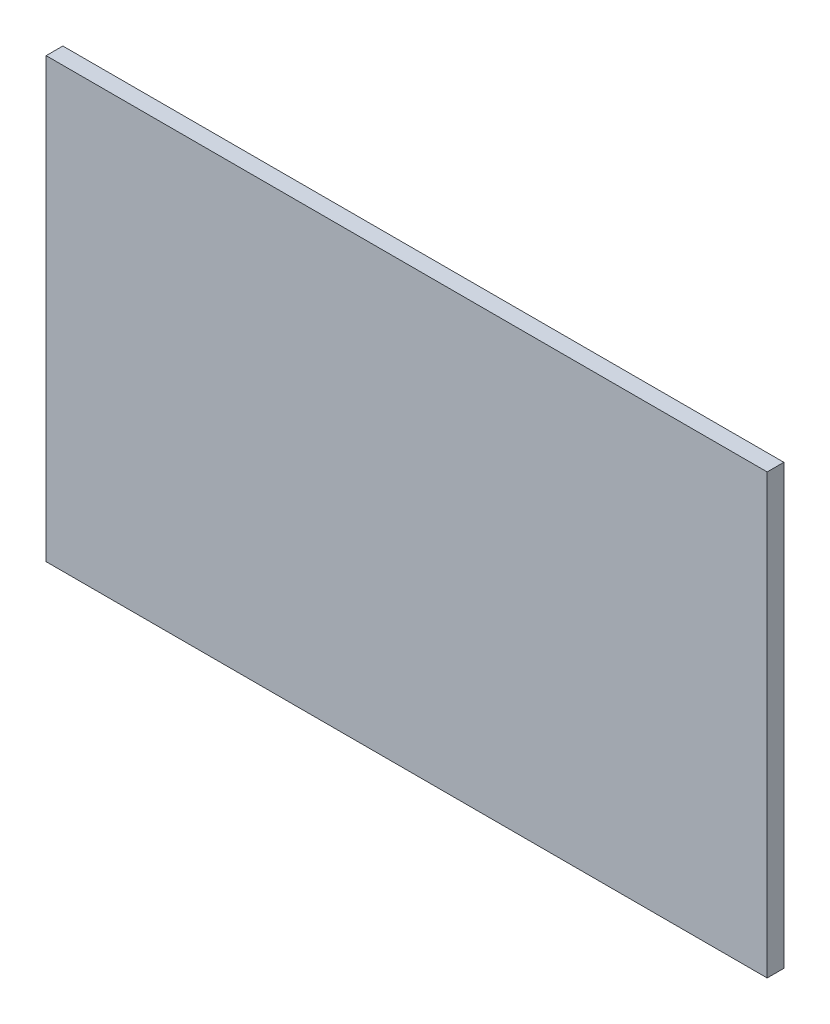
ISO-10303-21;
HEADER;
FILE_DESCRIPTION(('STEP AP214'),'2;1');
FILE_NAME('part.step','',(''),(''),'','','');
FILE_SCHEMA(('AUTOMOTIVE_DESIGN { 1 0 10303 214 1 1 1 1 }'));
ENDSEC;
DATA;
#1=APPLICATION_CONTEXT('core data for automotive mechanical design processes');
#2=APPLICATION_PROTOCOL_DEFINITION('international standard','automotive_design',2000,#1);
#3=PRODUCT_CONTEXT('',#1,'mechanical');
#4=PRODUCT('Part','Part','',(#3));
#5=PRODUCT_RELATED_PRODUCT_CATEGORY('part','',(#4));
#6=PRODUCT_DEFINITION_FORMATION('','',#4);
#7=PRODUCT_DEFINITION_CONTEXT('part definition',#1,'design');
#8=PRODUCT_DEFINITION('design','',#6,#7);
#9=PRODUCT_DEFINITION_SHAPE('','',#8);
#10=(LENGTH_UNIT() NAMED_UNIT(*) SI_UNIT(.MILLI.,.METRE.));
#11=(NAMED_UNIT(*) PLANE_ANGLE_UNIT() SI_UNIT($,.RADIAN.));
#12=(NAMED_UNIT(*) SI_UNIT($,.STERADIAN.) SOLID_ANGLE_UNIT());
#13=UNCERTAINTY_MEASURE_WITH_UNIT(LENGTH_MEASURE(1.E-05),#10,'distance_accuracy_value','');
#14=(GEOMETRIC_REPRESENTATION_CONTEXT(3) GLOBAL_UNCERTAINTY_ASSIGNED_CONTEXT((#13)) GLOBAL_UNIT_ASSIGNED_CONTEXT((#10,
#11,#12)) REPRESENTATION_CONTEXT('',''));
#15=CARTESIAN_POINT('',(0.,0.,0.));
#16=DIRECTION('',(0.,0.,1.));
#17=DIRECTION('',(1.,0.,0.));
#18=AXIS2_PLACEMENT_3D('',#15,#16,#17);
#19=CARTESIAN_POINT('',(374.218588466778,837.858278213205,3.));
#20=DIRECTION('',(1.,0.,0.));
#21=DIRECTION('',(0.,0.,-1.));
#22=AXIS2_PLACEMENT_3D('',#19,#20,#21);
#23=PLANE('',#22);
#24=DIRECTION('',(0.,-1.,0.));
#25=VECTOR('',#24,1.);
#26=CARTESIAN_POINT('',(374.218588466778,837.858278213205,0.));
#27=LINE('',#26,#25);
#28=CARTESIAN_POINT('',(374.218588466778,916.598278213206,0.));
#29=VERTEX_POINT('',#28);
#30=CARTESIAN_POINT('',(374.218588466778,837.858278213205,0.));
#31=VERTEX_POINT('',#30);
#32=EDGE_CURVE('E104',#29,#31,#27,.T.);
#33=ORIENTED_EDGE('',*,*,#32,.T.);
#34=DIRECTION('',(0.,0.,-1.));
#35=VECTOR('',#34,1.);
#36=CARTESIAN_POINT('',(374.218588466778,837.858278213205,3.));
#37=LINE('',#36,#35);
#38=CARTESIAN_POINT('',(374.218588466778,837.858278213205,3.));
#39=VERTEX_POINT('',#38);
#40=EDGE_CURVE('E11',#39,#31,#37,.T.);
#41=ORIENTED_EDGE('',*,*,#40,.F.);
#42=DIRECTION('',(0.,-1.,0.));
#43=VECTOR('',#42,1.);
#44=CARTESIAN_POINT('',(374.218588466778,837.858278213205,3.));
#45=LINE('',#44,#43);
#46=CARTESIAN_POINT('',(374.218588466778,916.598278213206,3.));
#47=VERTEX_POINT('',#46);
#48=EDGE_CURVE('E92',#47,#39,#45,.T.);
#49=ORIENTED_EDGE('',*,*,#48,.F.);
#50=DIRECTION('',(0.,0.,-1.));
#51=VECTOR('',#50,1.);
#52=CARTESIAN_POINT('',(374.218588466778,916.598278213206,3.));
#53=LINE('',#52,#51);
#54=EDGE_CURVE('E100',#47,#29,#53,.T.);
#55=ORIENTED_EDGE('',*,*,#54,.T.);
#56=EDGE_LOOP('',(#33,#41,#49,#55));
#57=FACE_BOUND('',#56,.T.);
#58=ADVANCED_FACE('F41',(#57),#23,.F.);
#59=CARTESIAN_POINT('',(503.758588466778,837.858278213205,3.));
#60=DIRECTION('',(0.,1.,0.));
#61=DIRECTION('',(0.,0.,1.));
#62=AXIS2_PLACEMENT_3D('',#59,#60,#61);
#63=PLANE('',#62);
#64=DIRECTION('',(1.,0.,0.));
#65=VECTOR('',#64,1.);
#66=CARTESIAN_POINT('',(503.758588466778,837.858278213205,0.));
#67=LINE('',#66,#65);
#68=CARTESIAN_POINT('',(503.758588466778,837.858278213205,0.));
#69=VERTEX_POINT('',#68);
#70=EDGE_CURVE('E96',#31,#69,#67,.T.);
#71=ORIENTED_EDGE('',*,*,#70,.T.);
#72=DIRECTION('',(0.,0.,-1.));
#73=VECTOR('',#72,1.);
#74=CARTESIAN_POINT('',(503.758588466778,837.858278213205,3.));
#75=LINE('',#74,#73);
#76=CARTESIAN_POINT('',(503.758588466778,837.858278213205,3.));
#77=VERTEX_POINT('',#76);
#78=EDGE_CURVE('E49',#77,#69,#75,.T.);
#79=ORIENTED_EDGE('',*,*,#78,.F.);
#80=DIRECTION('',(1.,0.,0.));
#81=VECTOR('',#80,1.);
#82=CARTESIAN_POINT('',(503.758588466778,837.858278213205,3.));
#83=LINE('',#82,#81);
#84=EDGE_CURVE('E87',#39,#77,#83,.T.);
#85=ORIENTED_EDGE('',*,*,#84,.F.);
#86=ORIENTED_EDGE('',*,*,#40,.T.);
#87=EDGE_LOOP('',(#71,#79,#85,#86));
#88=FACE_BOUND('',#87,.T.);
#89=ADVANCED_FACE('F95',(#88),#63,.F.);
#90=CARTESIAN_POINT('',(503.758588466778,916.598278213206,3.));
#91=DIRECTION('',(-1.,0.,0.));
#92=DIRECTION('',(0.,0.,1.));
#93=AXIS2_PLACEMENT_3D('',#90,#91,#92);
#94=PLANE('',#93);
#95=DIRECTION('',(0.,1.,0.));
#96=VECTOR('',#95,1.);
#97=CARTESIAN_POINT('',(503.758588466778,916.598278213206,0.));
#98=LINE('',#97,#96);
#99=CARTESIAN_POINT('',(503.758588466778,916.598278213206,0.));
#100=VERTEX_POINT('',#99);
#101=EDGE_CURVE('E74',#69,#100,#98,.T.);
#102=ORIENTED_EDGE('',*,*,#101,.T.);
#103=DIRECTION('',(0.,0.,-1.));
#104=VECTOR('',#103,1.);
#105=CARTESIAN_POINT('',(503.758588466778,916.598278213206,3.));
#106=LINE('',#105,#104);
#107=CARTESIAN_POINT('',(503.758588466778,916.598278213206,3.));
#108=VERTEX_POINT('',#107);
#109=EDGE_CURVE('E97',#108,#100,#106,.T.);
#110=ORIENTED_EDGE('',*,*,#109,.F.);
#111=DIRECTION('',(0.,1.,0.));
#112=VECTOR('',#111,1.);
#113=CARTESIAN_POINT('',(503.758588466778,916.598278213206,3.));
#114=LINE('',#113,#112);
#115=EDGE_CURVE('E90',#77,#108,#114,.T.);
#116=ORIENTED_EDGE('',*,*,#115,.F.);
#117=ORIENTED_EDGE('',*,*,#78,.T.);
#118=EDGE_LOOP('',(#102,#110,#116,#117));
#119=FACE_BOUND('',#118,.T.);
#120=ADVANCED_FACE('F98',(#119),#94,.F.);
#121=CARTESIAN_POINT('',(374.218588466778,916.598278213206,3.));
#122=DIRECTION('',(0.,-1.,0.));
#123=DIRECTION('',(0.,0.,-1.));
#124=AXIS2_PLACEMENT_3D('',#121,#122,#123);
#125=PLANE('',#124);
#126=DIRECTION('',(-1.,0.,0.));
#127=VECTOR('',#126,1.);
#128=CARTESIAN_POINT('',(374.218588466778,916.598278213206,0.));
#129=LINE('',#128,#127);
#130=EDGE_CURVE('E80',#100,#29,#129,.T.);
#131=ORIENTED_EDGE('',*,*,#130,.T.);
#132=ORIENTED_EDGE('',*,*,#54,.F.);
#133=DIRECTION('',(-1.,0.,0.));
#134=VECTOR('',#133,1.);
#135=CARTESIAN_POINT('',(374.218588466778,916.598278213206,3.));
#136=LINE('',#135,#134);
#137=EDGE_CURVE('E57',#108,#47,#136,.T.);
#138=ORIENTED_EDGE('',*,*,#137,.F.);
#139=ORIENTED_EDGE('',*,*,#109,.T.);
#140=EDGE_LOOP('',(#131,#132,#138,#139));
#141=FACE_BOUND('',#140,.T.);
#142=ADVANCED_FACE('F111',(#141),#125,.F.);
#143=CARTESIAN_POINT('',(0.,0.,3.));
#144=DIRECTION('',(0.,0.,-1.));
#145=DIRECTION('',(-1.,0.,0.));
#146=AXIS2_PLACEMENT_3D('',#143,#144,#145);
#147=PLANE('',#146);
#148=ORIENTED_EDGE('',*,*,#48,.T.);
#149=ORIENTED_EDGE('',*,*,#84,.T.);
#150=ORIENTED_EDGE('',*,*,#115,.T.);
#151=ORIENTED_EDGE('',*,*,#137,.T.);
#152=EDGE_LOOP('',(#148,#149,#150,#151));
#153=FACE_BOUND('',#152,.T.);
#154=ADVANCED_FACE('F88',(#153),#147,.F.);
#155=CARTESIAN_POINT('',(0.,0.,0.));
#156=DIRECTION('',(0.,0.,-1.));
#157=DIRECTION('',(-1.,0.,0.));
#158=AXIS2_PLACEMENT_3D('',#155,#156,#157);
#159=PLANE('',#158);
#160=ORIENTED_EDGE('',*,*,#32,.F.);
#161=ORIENTED_EDGE('',*,*,#130,.F.);
#162=ORIENTED_EDGE('',*,*,#101,.F.);
#163=ORIENTED_EDGE('',*,*,#70,.F.);
#164=EDGE_LOOP('',(#160,#161,#162,#163));
#165=FACE_BOUND('',#164,.T.);
#166=ADVANCED_FACE('F114',(#165),#159,.T.);
#167=CLOSED_SHELL('',(#58,#89,#120,#142,#154,#166));
#168=MANIFOLD_SOLID_BREP('B2',#167);
#169=ADVANCED_BREP_SHAPE_REPRESENTATION('',(#18,#168),#14);
#170=SHAPE_DEFINITION_REPRESENTATION(#9,#169);
ENDSEC;
END-ISO-10303-21;
